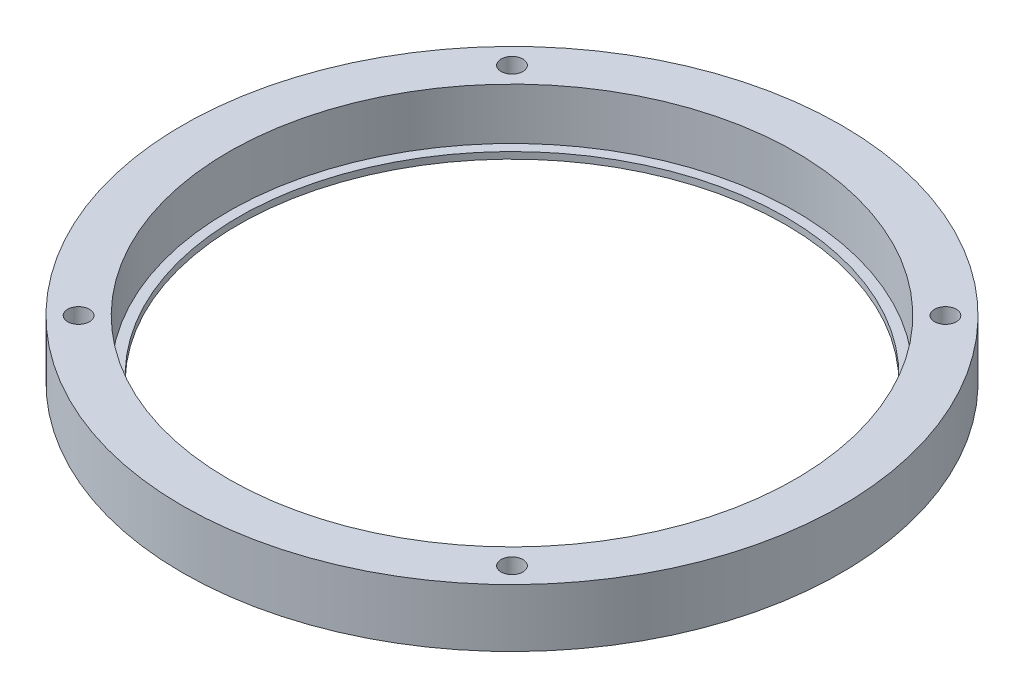
ISO-10303-21;
HEADER;
FILE_DESCRIPTION(('STEP AP214'),'2;1');
FILE_NAME('part.step','',(''),(''),'','','');
FILE_SCHEMA(('AUTOMOTIVE_DESIGN { 1 0 10303 214 1 1 1 1 }'));
ENDSEC;
DATA;
#1=APPLICATION_CONTEXT('core data for automotive mechanical design processes');
#2=APPLICATION_PROTOCOL_DEFINITION('international standard','automotive_design',2000,#1);
#3=PRODUCT_CONTEXT('',#1,'mechanical');
#4=PRODUCT('Part','Part','',(#3));
#5=PRODUCT_RELATED_PRODUCT_CATEGORY('part','',(#4));
#6=PRODUCT_DEFINITION_FORMATION('','',#4);
#7=PRODUCT_DEFINITION_CONTEXT('part definition',#1,'design');
#8=PRODUCT_DEFINITION('design','',#6,#7);
#9=PRODUCT_DEFINITION_SHAPE('','',#8);
#10=(LENGTH_UNIT() NAMED_UNIT(*) SI_UNIT(.MILLI.,.METRE.));
#11=(NAMED_UNIT(*) PLANE_ANGLE_UNIT() SI_UNIT($,.RADIAN.));
#12=(NAMED_UNIT(*) SI_UNIT($,.STERADIAN.) SOLID_ANGLE_UNIT());
#13=UNCERTAINTY_MEASURE_WITH_UNIT(LENGTH_MEASURE(1.E-05),#10,'distance_accuracy_value','');
#14=(GEOMETRIC_REPRESENTATION_CONTEXT(3) GLOBAL_UNCERTAINTY_ASSIGNED_CONTEXT((#13)) GLOBAL_UNIT_ASSIGNED_CONTEXT((#10,
#11,#12)) REPRESENTATION_CONTEXT('',''));
#15=CARTESIAN_POINT('',(0.,0.,0.));
#16=DIRECTION('',(0.,0.,1.));
#17=DIRECTION('',(1.,0.,0.));
#18=AXIS2_PLACEMENT_3D('',#15,#16,#17);
#19=CARTESIAN_POINT('',(0.,7.8,0.));
#20=DIRECTION('',(0.,1.,0.));
#21=DIRECTION('',(0.,0.,1.));
#22=AXIS2_PLACEMENT_3D('',#19,#20,#21);
#23=PLANE('',#22);
#24=CARTESIAN_POINT('',(-32.8804653251745,7.8,-32.8804653251745));
#25=DIRECTION('',(0.,1.,0.));
#26=DIRECTION('',(0.,0.,1.));
#27=AXIS2_PLACEMENT_3D('',#24,#25,#26);
#28=CIRCLE('',#27,1.64999999999999);
#29=CARTESIAN_POINT('',(-32.8804653251745,7.8,-31.2304653251745));
#30=VERTEX_POINT('',#29);
#31=EDGE_CURVE('E90',#30,#30,#28,.T.);
#32=ORIENTED_EDGE('',*,*,#31,.F.);
#33=EDGE_LOOP('',(#32));
#34=FACE_BOUND('',#33,.T.);
#35=CARTESIAN_POINT('',(-32.8804653251745,7.8,32.8804653251745));
#36=DIRECTION('',(0.,1.,0.));
#37=DIRECTION('',(0.,0.,1.));
#38=AXIS2_PLACEMENT_3D('',#35,#36,#37);
#39=CIRCLE('',#38,1.64999999999999);
#40=CARTESIAN_POINT('',(-32.8804653251745,7.8,34.5304653251745));
#41=VERTEX_POINT('',#40);
#42=EDGE_CURVE('E84',#41,#41,#39,.T.);
#43=ORIENTED_EDGE('',*,*,#42,.F.);
#44=EDGE_LOOP('',(#43));
#45=FACE_BOUND('',#44,.T.);
#46=CARTESIAN_POINT('',(32.8804653251745,7.8,32.8804653251745));
#47=DIRECTION('',(0.,1.,0.));
#48=DIRECTION('',(0.,0.,1.));
#49=AXIS2_PLACEMENT_3D('',#46,#47,#48);
#50=CIRCLE('',#49,1.64999999999999);
#51=CARTESIAN_POINT('',(32.8804653251745,7.8,34.5304653251745));
#52=VERTEX_POINT('',#51);
#53=EDGE_CURVE('E78',#52,#52,#50,.T.);
#54=ORIENTED_EDGE('',*,*,#53,.F.);
#55=EDGE_LOOP('',(#54));
#56=FACE_BOUND('',#55,.T.);
#57=CARTESIAN_POINT('',(32.8804653251745,7.8,-32.8804653251745));
#58=DIRECTION('',(0.,1.,0.));
#59=DIRECTION('',(0.,0.,1.));
#60=AXIS2_PLACEMENT_3D('',#57,#58,#59);
#61=CIRCLE('',#60,1.64999999999999);
#62=CARTESIAN_POINT('',(32.8804653251745,7.8,-31.2304653251745));
#63=VERTEX_POINT('',#62);
#64=EDGE_CURVE('E72',#63,#63,#61,.T.);
#65=ORIENTED_EDGE('',*,*,#64,.F.);
#66=EDGE_LOOP('',(#65));
#67=FACE_BOUND('',#66,.T.);
#68=CARTESIAN_POINT('',(0.,7.8,0.));
#69=DIRECTION('',(0.,1.,0.));
#70=DIRECTION('',(0.,0.,1.));
#71=AXIS2_PLACEMENT_3D('',#68,#69,#70);
#72=CIRCLE('',#71,50.);
#73=CARTESIAN_POINT('',(0.,7.8,50.));
#74=VERTEX_POINT('',#73);
#75=EDGE_CURVE('E10',#74,#74,#72,.T.);
#76=ORIENTED_EDGE('',*,*,#75,.T.);
#77=EDGE_LOOP('',(#76));
#78=FACE_BOUND('',#77,.T.);
#79=CARTESIAN_POINT('',(0.,7.8,0.));
#80=DIRECTION('',(0.,1.,0.));
#81=DIRECTION('',(0.,0.,1.));
#82=AXIS2_PLACEMENT_3D('',#79,#80,#81);
#83=CIRCLE('',#82,43.);
#84=CARTESIAN_POINT('',(0.,7.8,43.));
#85=VERTEX_POINT('',#84);
#86=EDGE_CURVE('E50',#85,#85,#83,.T.);
#87=ORIENTED_EDGE('',*,*,#86,.F.);
#88=EDGE_LOOP('',(#87));
#89=FACE_BOUND('',#88,.T.);
#90=ADVANCED_FACE('F43',(#34,#45,#56,#67,#78,#89),#23,.T.);
#91=CARTESIAN_POINT('',(0.,7.8,0.));
#92=DIRECTION('',(0.,-1.,0.));
#93=DIRECTION('',(0.,0.,-1.));
#94=AXIS2_PLACEMENT_3D('',#91,#92,#93);
#95=CYLINDRICAL_SURFACE('',#94,50.);
#96=ORIENTED_EDGE('',*,*,#75,.F.);
#97=EDGE_LOOP('',(#96));
#98=FACE_BOUND('',#97,.T.);
#99=CARTESIAN_POINT('',(0.,-1.,0.));
#100=DIRECTION('',(0.,-1.,0.));
#101=DIRECTION('',(0.,0.,-1.));
#102=AXIS2_PLACEMENT_3D('',#99,#100,#101);
#103=CIRCLE('',#102,50.);
#104=CARTESIAN_POINT('',(0.,-1.,-50.));
#105=VERTEX_POINT('',#104);
#106=EDGE_CURVE('E59',#105,#105,#103,.T.);
#107=ORIENTED_EDGE('',*,*,#106,.F.);
#108=EDGE_LOOP('',(#107));
#109=FACE_BOUND('',#108,.T.);
#110=ADVANCED_FACE('F45',(#98,#109),#95,.T.);
#111=CARTESIAN_POINT('',(0.,7.8,0.));
#112=DIRECTION('',(0.,-1.,0.));
#113=DIRECTION('',(0.,0.,-1.));
#114=AXIS2_PLACEMENT_3D('',#111,#112,#113);
#115=CYLINDRICAL_SURFACE('',#114,43.);
#116=ORIENTED_EDGE('',*,*,#86,.T.);
#117=EDGE_LOOP('',(#116));
#118=FACE_BOUND('',#117,.T.);
#119=CARTESIAN_POINT('',(0.,0.,0.));
#120=DIRECTION('',(0.,1.,0.));
#121=DIRECTION('',(0.,0.,1.));
#122=AXIS2_PLACEMENT_3D('',#119,#120,#121);
#123=CIRCLE('',#122,43.);
#124=CARTESIAN_POINT('',(0.,0.,43.));
#125=VERTEX_POINT('',#124);
#126=EDGE_CURVE('E54',#125,#125,#123,.T.);
#127=ORIENTED_EDGE('',*,*,#126,.F.);
#128=EDGE_LOOP('',(#127));
#129=FACE_BOUND('',#128,.T.);
#130=ADVANCED_FACE('F130',(#118,#129),#115,.F.);
#131=CARTESIAN_POINT('',(0.,0.,0.));
#132=DIRECTION('',(0.,-1.,0.));
#133=DIRECTION('',(0.,0.,-1.));
#134=AXIS2_PLACEMENT_3D('',#131,#132,#133);
#135=PLANE('',#134);
#136=CARTESIAN_POINT('',(0.,0.,0.));
#137=DIRECTION('',(0.,-1.,0.));
#138=DIRECTION('',(0.,0.,-1.));
#139=AXIS2_PLACEMENT_3D('',#136,#137,#138);
#140=CIRCLE('',#139,41.5);
#141=CARTESIAN_POINT('',(0.,0.,-41.5));
#142=VERTEX_POINT('',#141);
#143=EDGE_CURVE('E64',#142,#142,#140,.T.);
#144=ORIENTED_EDGE('',*,*,#143,.T.);
#145=EDGE_LOOP('',(#144));
#146=FACE_BOUND('',#145,.T.);
#147=ORIENTED_EDGE('',*,*,#126,.T.);
#148=EDGE_LOOP('',(#147));
#149=FACE_BOUND('',#148,.T.);
#150=ADVANCED_FACE('F126',(#146,#149),#135,.F.);
#151=CARTESIAN_POINT('',(0.,-1.,0.));
#152=DIRECTION('',(0.,-1.,0.));
#153=DIRECTION('',(0.,0.,-1.));
#154=AXIS2_PLACEMENT_3D('',#151,#152,#153);
#155=PLANE('',#154);
#156=CARTESIAN_POINT('',(-32.8804653251745,-0.999999999999999,-32.8804653251745));
#157=DIRECTION('',(0.,1.,0.));
#158=DIRECTION('',(0.,0.,1.));
#159=AXIS2_PLACEMENT_3D('',#156,#157,#158);
#160=CIRCLE('',#159,1.65);
#161=CARTESIAN_POINT('',(-32.8804653251745,-0.999999999999999,-31.2304653251745));
#162=VERTEX_POINT('',#161);
#163=EDGE_CURVE('E87',#162,#162,#160,.T.);
#164=ORIENTED_EDGE('',*,*,#163,.T.);
#165=EDGE_LOOP('',(#164));
#166=FACE_BOUND('',#165,.T.);
#167=CARTESIAN_POINT('',(-32.8804653251745,-0.999999999999999,32.8804653251745));
#168=DIRECTION('',(0.,1.,0.));
#169=DIRECTION('',(0.,0.,1.));
#170=AXIS2_PLACEMENT_3D('',#167,#168,#169);
#171=CIRCLE('',#170,1.65);
#172=CARTESIAN_POINT('',(-32.8804653251745,-0.999999999999999,34.5304653251745));
#173=VERTEX_POINT('',#172);
#174=EDGE_CURVE('E81',#173,#173,#171,.T.);
#175=ORIENTED_EDGE('',*,*,#174,.T.);
#176=EDGE_LOOP('',(#175));
#177=FACE_BOUND('',#176,.T.);
#178=CARTESIAN_POINT('',(32.8804653251745,-0.999999999999999,32.8804653251745));
#179=DIRECTION('',(0.,1.,0.));
#180=DIRECTION('',(0.,0.,1.));
#181=AXIS2_PLACEMENT_3D('',#178,#179,#180);
#182=CIRCLE('',#181,1.65);
#183=CARTESIAN_POINT('',(32.8804653251745,-0.999999999999999,34.5304653251745));
#184=VERTEX_POINT('',#183);
#185=EDGE_CURVE('E75',#184,#184,#182,.T.);
#186=ORIENTED_EDGE('',*,*,#185,.T.);
#187=EDGE_LOOP('',(#186));
#188=FACE_BOUND('',#187,.T.);
#189=CARTESIAN_POINT('',(32.8804653251745,-0.999999999999999,-32.8804653251745));
#190=DIRECTION('',(0.,1.,0.));
#191=DIRECTION('',(0.,0.,1.));
#192=AXIS2_PLACEMENT_3D('',#189,#190,#191);
#193=CIRCLE('',#192,1.65);
#194=CARTESIAN_POINT('',(32.8804653251745,-0.999999999999999,-31.2304653251745));
#195=VERTEX_POINT('',#194);
#196=EDGE_CURVE('E67',#195,#195,#193,.T.);
#197=ORIENTED_EDGE('',*,*,#196,.T.);
#198=EDGE_LOOP('',(#197));
#199=FACE_BOUND('',#198,.T.);
#200=ORIENTED_EDGE('',*,*,#106,.T.);
#201=EDGE_LOOP('',(#200));
#202=FACE_BOUND('',#201,.T.);
#203=CARTESIAN_POINT('',(0.,-1.,0.));
#204=DIRECTION('',(0.,-1.,0.));
#205=DIRECTION('',(0.,0.,-1.));
#206=AXIS2_PLACEMENT_3D('',#203,#204,#205);
#207=CIRCLE('',#206,41.5);
#208=CARTESIAN_POINT('',(0.,-1.,-41.5));
#209=VERTEX_POINT('',#208);
#210=EDGE_CURVE('E63',#209,#209,#207,.T.);
#211=ORIENTED_EDGE('',*,*,#210,.F.);
#212=EDGE_LOOP('',(#211));
#213=FACE_BOUND('',#212,.T.);
#214=ADVANCED_FACE('F118',(#166,#177,#188,#199,#202,#213),#155,.T.);
#215=CARTESIAN_POINT('',(0.,-1.,0.));
#216=DIRECTION('',(0.,1.,0.));
#217=DIRECTION('',(0.,0.,1.));
#218=AXIS2_PLACEMENT_3D('',#215,#216,#217);
#219=CYLINDRICAL_SURFACE('',#218,41.5);
#220=ORIENTED_EDGE('',*,*,#210,.T.);
#221=EDGE_LOOP('',(#220));
#222=FACE_BOUND('',#221,.T.);
#223=ORIENTED_EDGE('',*,*,#143,.F.);
#224=EDGE_LOOP('',(#223));
#225=FACE_BOUND('',#224,.T.);
#226=ADVANCED_FACE('F108',(#222,#225),#219,.F.);
#227=CARTESIAN_POINT('',(32.8804653251745,7.8,-32.8804653251745));
#228=DIRECTION('',(0.,1.,0.));
#229=DIRECTION('',(0.,0.,1.));
#230=AXIS2_PLACEMENT_3D('',#227,#228,#229);
#231=CYLINDRICAL_SURFACE('',#230,1.65);
#232=ORIENTED_EDGE('',*,*,#196,.F.);
#233=EDGE_LOOP('',(#232));
#234=FACE_BOUND('',#233,.T.);
#235=ORIENTED_EDGE('',*,*,#64,.T.);
#236=EDGE_LOOP('',(#235));
#237=FACE_BOUND('',#236,.T.);
#238=ADVANCED_FACE('F105',(#234,#237),#231,.F.);
#239=CARTESIAN_POINT('',(32.8804653251745,7.8,32.8804653251745));
#240=DIRECTION('',(0.,1.,0.));
#241=DIRECTION('',(0.,0.,1.));
#242=AXIS2_PLACEMENT_3D('',#239,#240,#241);
#243=CYLINDRICAL_SURFACE('',#242,1.65);
#244=ORIENTED_EDGE('',*,*,#185,.F.);
#245=EDGE_LOOP('',(#244));
#246=FACE_BOUND('',#245,.T.);
#247=ORIENTED_EDGE('',*,*,#53,.T.);
#248=EDGE_LOOP('',(#247));
#249=FACE_BOUND('',#248,.T.);
#250=ADVANCED_FACE('F107',(#246,#249),#243,.F.);
#251=CARTESIAN_POINT('',(-32.8804653251745,7.8,32.8804653251745));
#252=DIRECTION('',(0.,1.,0.));
#253=DIRECTION('',(0.,0.,1.));
#254=AXIS2_PLACEMENT_3D('',#251,#252,#253);
#255=CYLINDRICAL_SURFACE('',#254,1.64999999999999);
#256=ORIENTED_EDGE('',*,*,#174,.F.);
#257=EDGE_LOOP('',(#256));
#258=FACE_BOUND('',#257,.T.);
#259=ORIENTED_EDGE('',*,*,#42,.T.);
#260=EDGE_LOOP('',(#259));
#261=FACE_BOUND('',#260,.T.);
#262=ADVANCED_FACE('F114',(#258,#261),#255,.F.);
#263=CARTESIAN_POINT('',(-32.8804653251745,7.8,-32.8804653251745));
#264=DIRECTION('',(0.,1.,0.));
#265=DIRECTION('',(0.,0.,1.));
#266=AXIS2_PLACEMENT_3D('',#263,#264,#265);
#267=CYLINDRICAL_SURFACE('',#266,1.64999999999999);
#268=ORIENTED_EDGE('',*,*,#163,.F.);
#269=EDGE_LOOP('',(#268));
#270=FACE_BOUND('',#269,.T.);
#271=ORIENTED_EDGE('',*,*,#31,.T.);
#272=EDGE_LOOP('',(#271));
#273=FACE_BOUND('',#272,.T.);
#274=ADVANCED_FACE('F94',(#270,#273),#267,.F.);
#275=CLOSED_SHELL('',(#90,#110,#130,#150,#214,#226,#238,#250,#262,#274));
#276=MANIFOLD_SOLID_BREP('B2',#275);
#277=ADVANCED_BREP_SHAPE_REPRESENTATION('',(#18,#276),#14);
#278=SHAPE_DEFINITION_REPRESENTATION(#9,#277);
ENDSEC;
END-ISO-10303-21;
